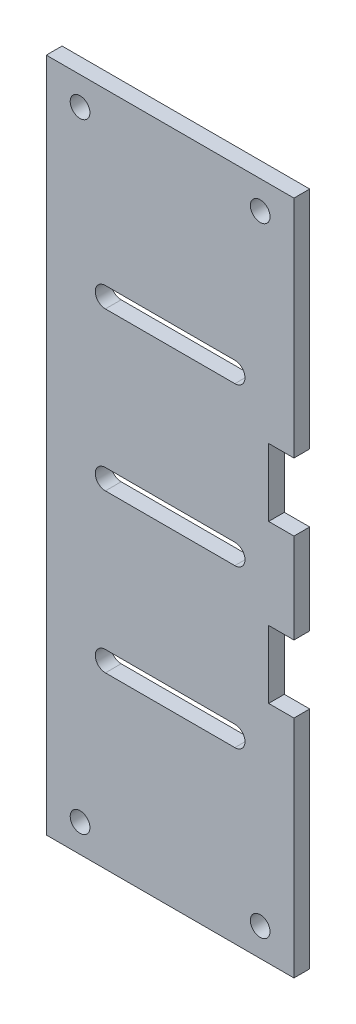
ISO-10303-21;
HEADER;
FILE_DESCRIPTION(('STEP AP214'),'2;1');
FILE_NAME('part.step','',(''),(''),'','','');
FILE_SCHEMA(('AUTOMOTIVE_DESIGN { 1 0 10303 214 1 1 1 1 }'));
ENDSEC;
DATA;
#1=APPLICATION_CONTEXT('core data for automotive mechanical design processes');
#2=APPLICATION_PROTOCOL_DEFINITION('international standard','automotive_design',2000,#1);
#3=PRODUCT_CONTEXT('',#1,'mechanical');
#4=PRODUCT('Part','Part','',(#3));
#5=PRODUCT_RELATED_PRODUCT_CATEGORY('part','',(#4));
#6=PRODUCT_DEFINITION_FORMATION('','',#4);
#7=PRODUCT_DEFINITION_CONTEXT('part definition',#1,'design');
#8=PRODUCT_DEFINITION('design','',#6,#7);
#9=PRODUCT_DEFINITION_SHAPE('','',#8);
#10=(LENGTH_UNIT() NAMED_UNIT(*) SI_UNIT(.MILLI.,.METRE.));
#11=(NAMED_UNIT(*) PLANE_ANGLE_UNIT() SI_UNIT($,.RADIAN.));
#12=(NAMED_UNIT(*) SI_UNIT($,.STERADIAN.) SOLID_ANGLE_UNIT());
#13=UNCERTAINTY_MEASURE_WITH_UNIT(LENGTH_MEASURE(1.E-05),#10,'distance_accuracy_value','');
#14=(GEOMETRIC_REPRESENTATION_CONTEXT(3) GLOBAL_UNCERTAINTY_ASSIGNED_CONTEXT((#13)) GLOBAL_UNIT_ASSIGNED_CONTEXT((#10,
#11,#12)) REPRESENTATION_CONTEXT('',''));
#15=CARTESIAN_POINT('',(0.,0.,0.));
#16=DIRECTION('',(0.,0.,1.));
#17=DIRECTION('',(1.,0.,0.));
#18=AXIS2_PLACEMENT_3D('',#15,#16,#17);
#19=CARTESIAN_POINT('',(0.,0.,2.8));
#20=DIRECTION('',(0.,0.,1.));
#21=DIRECTION('',(1.,0.,0.));
#22=AXIS2_PLACEMENT_3D('',#19,#20,#21);
#23=PLANE('',#22);
#24=CARTESIAN_POINT('',(16.,-55.,2.8));
#25=DIRECTION('',(0.,0.,1.));
#26=DIRECTION('',(1.,0.,0.));
#27=AXIS2_PLACEMENT_3D('',#24,#25,#26);
#28=CIRCLE('',#27,1.75);
#29=CARTESIAN_POINT('',(17.75,-55.,2.8));
#30=VERTEX_POINT('',#29);
#31=EDGE_CURVE('E304',#30,#30,#28,.T.);
#32=ORIENTED_EDGE('',*,*,#31,.F.);
#33=EDGE_LOOP('',(#32));
#34=FACE_BOUND('',#33,.T.);
#35=CARTESIAN_POINT('',(-16.,-55.,2.8));
#36=DIRECTION('',(0.,0.,1.));
#37=DIRECTION('',(1.,0.,0.));
#38=AXIS2_PLACEMENT_3D('',#35,#36,#37);
#39=CIRCLE('',#38,1.75);
#40=CARTESIAN_POINT('',(-14.25,-55.,2.8));
#41=VERTEX_POINT('',#40);
#42=EDGE_CURVE('E316',#41,#41,#39,.T.);
#43=ORIENTED_EDGE('',*,*,#42,.F.);
#44=EDGE_LOOP('',(#43));
#45=FACE_BOUND('',#44,.T.);
#46=DIRECTION('',(0.,-1.,0.));
#47=VECTOR('',#46,1.);
#48=CARTESIAN_POINT('',(-22.,60.,2.8));
#49=LINE('',#48,#47);
#50=CARTESIAN_POINT('',(-22.,60.,2.8));
#51=VERTEX_POINT('',#50);
#52=CARTESIAN_POINT('',(-22.,-60.,2.8));
#53=VERTEX_POINT('',#52);
#54=EDGE_CURVE('E322',#51,#53,#49,.T.);
#55=ORIENTED_EDGE('',*,*,#54,.T.);
#56=DIRECTION('',(1.,0.,0.));
#57=VECTOR('',#56,1.);
#58=CARTESIAN_POINT('',(-22.,-60.,2.8));
#59=LINE('',#58,#57);
#60=CARTESIAN_POINT('',(22.,-60.,2.8));
#61=VERTEX_POINT('',#60);
#62=EDGE_CURVE('E325',#53,#61,#59,.T.);
#63=ORIENTED_EDGE('',*,*,#62,.T.);
#64=DIRECTION('',(0.,1.,0.));
#65=VECTOR('',#64,1.);
#66=CARTESIAN_POINT('',(22.,-60.,2.8));
#67=LINE('',#66,#65);
#68=CARTESIAN_POINT('',(22.,-20.,2.8));
#69=VERTEX_POINT('',#68);
#70=EDGE_CURVE('E328',#61,#69,#67,.T.);
#71=ORIENTED_EDGE('',*,*,#70,.T.);
#72=DIRECTION('',(-1.,0.,0.));
#73=VECTOR('',#72,1.);
#74=CARTESIAN_POINT('',(22.,-20.,2.8));
#75=LINE('',#74,#73);
#76=CARTESIAN_POINT('',(17.5,-20.,2.8));
#77=VERTEX_POINT('',#76);
#78=EDGE_CURVE('E330',#69,#77,#75,.T.);
#79=ORIENTED_EDGE('',*,*,#78,.T.);
#80=DIRECTION('',(0.,1.,0.));
#81=VECTOR('',#80,1.);
#82=CARTESIAN_POINT('',(17.5,-20.,2.8));
#83=LINE('',#82,#81);
#84=CARTESIAN_POINT('',(17.5,-8.,2.8));
#85=VERTEX_POINT('',#84);
#86=EDGE_CURVE('E332',#77,#85,#83,.T.);
#87=ORIENTED_EDGE('',*,*,#86,.T.);
#88=DIRECTION('',(1.,0.,0.));
#89=VECTOR('',#88,1.);
#90=CARTESIAN_POINT('',(17.5,-8.,2.8));
#91=LINE('',#90,#89);
#92=CARTESIAN_POINT('',(22.,-8.,2.8));
#93=VERTEX_POINT('',#92);
#94=EDGE_CURVE('E334',#85,#93,#91,.T.);
#95=ORIENTED_EDGE('',*,*,#94,.T.);
#96=DIRECTION('',(0.,1.,0.));
#97=VECTOR('',#96,1.);
#98=CARTESIAN_POINT('',(22.,-8.,2.8));
#99=LINE('',#98,#97);
#100=CARTESIAN_POINT('',(22.,8.,2.8));
#101=VERTEX_POINT('',#100);
#102=EDGE_CURVE('E336',#93,#101,#99,.T.);
#103=ORIENTED_EDGE('',*,*,#102,.T.);
#104=DIRECTION('',(-1.,0.,0.));
#105=VECTOR('',#104,1.);
#106=CARTESIAN_POINT('',(22.,8.,2.8));
#107=LINE('',#106,#105);
#108=CARTESIAN_POINT('',(17.5,8.,2.8));
#109=VERTEX_POINT('',#108);
#110=EDGE_CURVE('E338',#101,#109,#107,.T.);
#111=ORIENTED_EDGE('',*,*,#110,.T.);
#112=DIRECTION('',(0.,1.,0.));
#113=VECTOR('',#112,1.);
#114=CARTESIAN_POINT('',(17.5,8.,2.8));
#115=LINE('',#114,#113);
#116=CARTESIAN_POINT('',(17.5,20.,2.8));
#117=VERTEX_POINT('',#116);
#118=EDGE_CURVE('E340',#109,#117,#115,.T.);
#119=ORIENTED_EDGE('',*,*,#118,.T.);
#120=DIRECTION('',(1.,0.,0.));
#121=VECTOR('',#120,1.);
#122=CARTESIAN_POINT('',(17.5,20.,2.8));
#123=LINE('',#122,#121);
#124=CARTESIAN_POINT('',(22.,20.,2.8));
#125=VERTEX_POINT('',#124);
#126=EDGE_CURVE('E342',#117,#125,#123,.T.);
#127=ORIENTED_EDGE('',*,*,#126,.T.);
#128=DIRECTION('',(0.,1.,0.));
#129=VECTOR('',#128,1.);
#130=CARTESIAN_POINT('',(22.,20.,2.8));
#131=LINE('',#130,#129);
#132=CARTESIAN_POINT('',(22.,60.,2.8));
#133=VERTEX_POINT('',#132);
#134=EDGE_CURVE('E344',#125,#133,#131,.T.);
#135=ORIENTED_EDGE('',*,*,#134,.T.);
#136=DIRECTION('',(-1.,0.,0.));
#137=VECTOR('',#136,1.);
#138=CARTESIAN_POINT('',(22.,60.,2.8));
#139=LINE('',#138,#137);
#140=EDGE_CURVE('E346',#133,#51,#139,.T.);
#141=ORIENTED_EDGE('',*,*,#140,.T.);
#142=EDGE_LOOP('',(#55,#63,#71,#79,#87,#95,#103,#111,#119,#127,#135,#141));
#143=FACE_BOUND('',#142,.T.);
#144=CARTESIAN_POINT('',(-16.,55.,2.8));
#145=DIRECTION('',(0.,0.,1.));
#146=DIRECTION('',(1.,0.,0.));
#147=AXIS2_PLACEMENT_3D('',#144,#145,#146);
#148=CIRCLE('',#147,1.75);
#149=CARTESIAN_POINT('',(-14.25,55.,2.8));
#150=VERTEX_POINT('',#149);
#151=EDGE_CURVE('E310',#150,#150,#148,.T.);
#152=ORIENTED_EDGE('',*,*,#151,.F.);
#153=EDGE_LOOP('',(#152));
#154=FACE_BOUND('',#153,.T.);
#155=CARTESIAN_POINT('',(16.,55.,2.8));
#156=DIRECTION('',(0.,0.,1.));
#157=DIRECTION('',(1.,0.,0.));
#158=AXIS2_PLACEMENT_3D('',#155,#156,#157);
#159=CIRCLE('',#158,1.75);
#160=CARTESIAN_POINT('',(17.75,55.,2.8));
#161=VERTEX_POINT('',#160);
#162=EDGE_CURVE('E298',#161,#161,#159,.T.);
#163=ORIENTED_EDGE('',*,*,#162,.F.);
#164=EDGE_LOOP('',(#163));
#165=FACE_BOUND('',#164,.T.);
#166=DIRECTION('',(1.,0.,0.));
#167=VECTOR('',#166,1.);
#168=CARTESIAN_POINT('',(-11.5,-29.8,2.8));
#169=LINE('',#168,#167);
#170=CARTESIAN_POINT('',(-11.5,-29.8,2.8));
#171=VERTEX_POINT('',#170);
#172=CARTESIAN_POINT('',(11.5,-29.8,2.8));
#173=VERTEX_POINT('',#172);
#174=EDGE_CURVE('E269',#171,#173,#169,.T.);
#175=ORIENTED_EDGE('',*,*,#174,.F.);
#176=CARTESIAN_POINT('',(-11.5,-28.,2.8));
#177=DIRECTION('',(0.,0.,1.));
#178=DIRECTION('',(1.,0.,0.));
#179=AXIS2_PLACEMENT_3D('',#176,#177,#178);
#180=CIRCLE('',#179,1.8);
#181=CARTESIAN_POINT('',(-11.5,-26.2,2.8));
#182=VERTEX_POINT('',#181);
#183=EDGE_CURVE('E267',#182,#171,#180,.T.);
#184=ORIENTED_EDGE('',*,*,#183,.F.);
#185=DIRECTION('',(-1.,0.,0.));
#186=VECTOR('',#185,1.);
#187=CARTESIAN_POINT('',(11.5,-26.2,2.8));
#188=LINE('',#187,#186);
#189=CARTESIAN_POINT('',(11.5,-26.2,2.8));
#190=VERTEX_POINT('',#189);
#191=EDGE_CURVE('E275',#190,#182,#188,.T.);
#192=ORIENTED_EDGE('',*,*,#191,.F.);
#193=CARTESIAN_POINT('',(11.5,-28.,2.8));
#194=DIRECTION('',(0.,0.,1.));
#195=DIRECTION('',(1.,0.,0.));
#196=AXIS2_PLACEMENT_3D('',#193,#194,#195);
#197=CIRCLE('',#196,1.8);
#198=EDGE_CURVE('E272',#173,#190,#197,.T.);
#199=ORIENTED_EDGE('',*,*,#198,.F.);
#200=EDGE_LOOP('',(#175,#184,#192,#199));
#201=FACE_BOUND('',#200,.T.);
#202=DIRECTION('',(1.,0.,0.));
#203=VECTOR('',#202,1.);
#204=CARTESIAN_POINT('',(-11.5,-1.8,2.8));
#205=LINE('',#204,#203);
#206=CARTESIAN_POINT('',(-11.5,-1.8,2.8));
#207=VERTEX_POINT('',#206);
#208=CARTESIAN_POINT('',(11.5,-1.8,2.8));
#209=VERTEX_POINT('',#208);
#210=EDGE_CURVE('E238',#207,#209,#205,.T.);
#211=ORIENTED_EDGE('',*,*,#210,.F.);
#212=CARTESIAN_POINT('',(-11.5,0.,2.8));
#213=DIRECTION('',(0.,0.,1.));
#214=DIRECTION('',(1.,0.,0.));
#215=AXIS2_PLACEMENT_3D('',#212,#213,#214);
#216=CIRCLE('',#215,1.8);
#217=CARTESIAN_POINT('',(-11.5,1.8,2.8));
#218=VERTEX_POINT('',#217);
#219=EDGE_CURVE('E236',#218,#207,#216,.T.);
#220=ORIENTED_EDGE('',*,*,#219,.F.);
#221=DIRECTION('',(-1.,0.,0.));
#222=VECTOR('',#221,1.);
#223=CARTESIAN_POINT('',(11.5,1.8,2.8));
#224=LINE('',#223,#222);
#225=CARTESIAN_POINT('',(11.5,1.8,2.8));
#226=VERTEX_POINT('',#225);
#227=EDGE_CURVE('E244',#226,#218,#224,.T.);
#228=ORIENTED_EDGE('',*,*,#227,.F.);
#229=CARTESIAN_POINT('',(11.5,0.,2.8));
#230=DIRECTION('',(0.,0.,1.));
#231=DIRECTION('',(1.,0.,0.));
#232=AXIS2_PLACEMENT_3D('',#229,#230,#231);
#233=CIRCLE('',#232,1.8);
#234=EDGE_CURVE('E241',#209,#226,#233,.T.);
#235=ORIENTED_EDGE('',*,*,#234,.F.);
#236=EDGE_LOOP('',(#211,#220,#228,#235));
#237=FACE_BOUND('',#236,.T.);
#238=DIRECTION('',(1.,0.,0.));
#239=VECTOR('',#238,1.);
#240=CARTESIAN_POINT('',(-11.5,26.2,2.8));
#241=LINE('',#240,#239);
#242=CARTESIAN_POINT('',(-11.5,26.2,2.8));
#243=VERTEX_POINT('',#242);
#244=CARTESIAN_POINT('',(11.5,26.2,2.8));
#245=VERTEX_POINT('',#244);
#246=EDGE_CURVE('E208',#243,#245,#241,.T.);
#247=ORIENTED_EDGE('',*,*,#246,.F.);
#248=CARTESIAN_POINT('',(-11.5,28.,2.8));
#249=DIRECTION('',(0.,0.,1.));
#250=DIRECTION('',(1.,0.,0.));
#251=AXIS2_PLACEMENT_3D('',#248,#249,#250);
#252=CIRCLE('',#251,1.8);
#253=CARTESIAN_POINT('',(-11.5,29.8,2.8));
#254=VERTEX_POINT('',#253);
#255=EDGE_CURVE('E200',#254,#243,#252,.T.);
#256=ORIENTED_EDGE('',*,*,#255,.F.);
#257=DIRECTION('',(-1.,0.,0.));
#258=VECTOR('',#257,1.);
#259=CARTESIAN_POINT('',(11.5,29.8,2.8));
#260=LINE('',#259,#258);
#261=CARTESIAN_POINT('',(11.5,29.8,2.8));
#262=VERTEX_POINT('',#261);
#263=EDGE_CURVE('E222',#262,#254,#260,.T.);
#264=ORIENTED_EDGE('',*,*,#263,.F.);
#265=CARTESIAN_POINT('',(11.5,28.,2.8));
#266=DIRECTION('',(0.,0.,1.));
#267=DIRECTION('',(1.,0.,0.));
#268=AXIS2_PLACEMENT_3D('',#265,#266,#267);
#269=CIRCLE('',#268,1.8);
#270=EDGE_CURVE('E220',#245,#262,#269,.T.);
#271=ORIENTED_EDGE('',*,*,#270,.F.);
#272=EDGE_LOOP('',(#247,#256,#264,#271));
#273=FACE_BOUND('',#272,.T.);
#274=ADVANCED_FACE('F39',(#34,#45,#143,#154,#165,#201,#237,#273),#23,.T.);
#275=CARTESIAN_POINT('',(0.,0.,0.));
#276=DIRECTION('',(0.,0.,1.));
#277=DIRECTION('',(1.,0.,0.));
#278=AXIS2_PLACEMENT_3D('',#275,#276,#277);
#279=PLANE('',#278);
#280=CARTESIAN_POINT('',(-11.5,0.,0.));
#281=DIRECTION('',(0.,0.,1.));
#282=DIRECTION('',(1.,0.,0.));
#283=AXIS2_PLACEMENT_3D('',#280,#281,#282);
#284=CIRCLE('',#283,1.8);
#285=CARTESIAN_POINT('',(-11.5,1.8,0.));
#286=VERTEX_POINT('',#285);
#287=CARTESIAN_POINT('',(-11.5,-1.8,0.));
#288=VERTEX_POINT('',#287);
#289=EDGE_CURVE('E216',#286,#288,#284,.T.);
#290=ORIENTED_EDGE('',*,*,#289,.T.);
#291=DIRECTION('',(1.,0.,0.));
#292=VECTOR('',#291,1.);
#293=CARTESIAN_POINT('',(-11.5,-1.8,0.));
#294=LINE('',#293,#292);
#295=CARTESIAN_POINT('',(11.5,-1.8,0.));
#296=VERTEX_POINT('',#295);
#297=EDGE_CURVE('E249',#288,#296,#294,.T.);
#298=ORIENTED_EDGE('',*,*,#297,.T.);
#299=CARTESIAN_POINT('',(11.5,0.,0.));
#300=DIRECTION('',(0.,0.,1.));
#301=DIRECTION('',(1.,0.,0.));
#302=AXIS2_PLACEMENT_3D('',#299,#300,#301);
#303=CIRCLE('',#302,1.8);
#304=CARTESIAN_POINT('',(11.5,1.8,0.));
#305=VERTEX_POINT('',#304);
#306=EDGE_CURVE('E252',#296,#305,#303,.T.);
#307=ORIENTED_EDGE('',*,*,#306,.T.);
#308=DIRECTION('',(-1.,0.,0.));
#309=VECTOR('',#308,1.);
#310=CARTESIAN_POINT('',(11.5,1.8,0.));
#311=LINE('',#310,#309);
#312=EDGE_CURVE('E239',#305,#286,#311,.T.);
#313=ORIENTED_EDGE('',*,*,#312,.T.);
#314=EDGE_LOOP('',(#290,#298,#307,#313));
#315=FACE_BOUND('',#314,.T.);
#316=CARTESIAN_POINT('',(16.,55.,0.));
#317=DIRECTION('',(0.,0.,1.));
#318=DIRECTION('',(1.,0.,0.));
#319=AXIS2_PLACEMENT_3D('',#316,#317,#318);
#320=CIRCLE('',#319,1.75);
#321=CARTESIAN_POINT('',(17.75,55.,0.));
#322=VERTEX_POINT('',#321);
#323=EDGE_CURVE('E297',#322,#322,#320,.T.);
#324=ORIENTED_EDGE('',*,*,#323,.T.);
#325=EDGE_LOOP('',(#324));
#326=FACE_BOUND('',#325,.T.);
#327=CARTESIAN_POINT('',(16.,-55.,0.));
#328=DIRECTION('',(0.,0.,1.));
#329=DIRECTION('',(1.,0.,0.));
#330=AXIS2_PLACEMENT_3D('',#327,#328,#329);
#331=CIRCLE('',#330,1.75);
#332=CARTESIAN_POINT('',(17.75,-55.,0.));
#333=VERTEX_POINT('',#332);
#334=EDGE_CURVE('E301',#333,#333,#331,.T.);
#335=ORIENTED_EDGE('',*,*,#334,.T.);
#336=EDGE_LOOP('',(#335));
#337=FACE_BOUND('',#336,.T.);
#338=CARTESIAN_POINT('',(-16.,55.,0.));
#339=DIRECTION('',(0.,0.,1.));
#340=DIRECTION('',(1.,0.,0.));
#341=AXIS2_PLACEMENT_3D('',#338,#339,#340);
#342=CIRCLE('',#341,1.75);
#343=CARTESIAN_POINT('',(-14.25,55.,0.));
#344=VERTEX_POINT('',#343);
#345=EDGE_CURVE('E307',#344,#344,#342,.T.);
#346=ORIENTED_EDGE('',*,*,#345,.T.);
#347=EDGE_LOOP('',(#346));
#348=FACE_BOUND('',#347,.T.);
#349=CARTESIAN_POINT('',(-16.,-55.,0.));
#350=DIRECTION('',(0.,0.,1.));
#351=DIRECTION('',(1.,0.,0.));
#352=AXIS2_PLACEMENT_3D('',#349,#350,#351);
#353=CIRCLE('',#352,1.75);
#354=CARTESIAN_POINT('',(-14.25,-55.,0.));
#355=VERTEX_POINT('',#354);
#356=EDGE_CURVE('E313',#355,#355,#353,.T.);
#357=ORIENTED_EDGE('',*,*,#356,.T.);
#358=EDGE_LOOP('',(#357));
#359=FACE_BOUND('',#358,.T.);
#360=DIRECTION('',(0.,-1.,0.));
#361=VECTOR('',#360,1.);
#362=CARTESIAN_POINT('',(-22.,60.,0.));
#363=LINE('',#362,#361);
#364=CARTESIAN_POINT('',(-22.,60.,0.));
#365=VERTEX_POINT('',#364);
#366=CARTESIAN_POINT('',(-22.,-60.,0.));
#367=VERTEX_POINT('',#366);
#368=EDGE_CURVE('E319',#365,#367,#363,.T.);
#369=ORIENTED_EDGE('',*,*,#368,.F.);
#370=DIRECTION('',(-1.,0.,0.));
#371=VECTOR('',#370,1.);
#372=CARTESIAN_POINT('',(22.,60.,0.));
#373=LINE('',#372,#371);
#374=CARTESIAN_POINT('',(22.,60.,0.));
#375=VERTEX_POINT('',#374);
#376=EDGE_CURVE('E326',#375,#365,#373,.T.);
#377=ORIENTED_EDGE('',*,*,#376,.F.);
#378=DIRECTION('',(0.,1.,0.));
#379=VECTOR('',#378,1.);
#380=CARTESIAN_POINT('',(22.,20.,0.));
#381=LINE('',#380,#379);
#382=CARTESIAN_POINT('',(22.,20.,0.));
#383=VERTEX_POINT('',#382);
#384=EDGE_CURVE('E369',#383,#375,#381,.T.);
#385=ORIENTED_EDGE('',*,*,#384,.F.);
#386=DIRECTION('',(1.,0.,0.));
#387=VECTOR('',#386,1.);
#388=CARTESIAN_POINT('',(17.5,20.,0.));
#389=LINE('',#388,#387);
#390=CARTESIAN_POINT('',(17.5,20.,0.));
#391=VERTEX_POINT('',#390);
#392=EDGE_CURVE('E367',#391,#383,#389,.T.);
#393=ORIENTED_EDGE('',*,*,#392,.F.);
#394=DIRECTION('',(0.,1.,0.));
#395=VECTOR('',#394,1.);
#396=CARTESIAN_POINT('',(17.5,8.,0.));
#397=LINE('',#396,#395);
#398=CARTESIAN_POINT('',(17.5,8.,0.));
#399=VERTEX_POINT('',#398);
#400=EDGE_CURVE('E365',#399,#391,#397,.T.);
#401=ORIENTED_EDGE('',*,*,#400,.F.);
#402=DIRECTION('',(-1.,0.,0.));
#403=VECTOR('',#402,1.);
#404=CARTESIAN_POINT('',(22.,8.,0.));
#405=LINE('',#404,#403);
#406=CARTESIAN_POINT('',(22.,8.,0.));
#407=VERTEX_POINT('',#406);
#408=EDGE_CURVE('E363',#407,#399,#405,.T.);
#409=ORIENTED_EDGE('',*,*,#408,.F.);
#410=DIRECTION('',(0.,1.,0.));
#411=VECTOR('',#410,1.);
#412=CARTESIAN_POINT('',(22.,-8.,0.));
#413=LINE('',#412,#411);
#414=CARTESIAN_POINT('',(22.,-8.,0.));
#415=VERTEX_POINT('',#414);
#416=EDGE_CURVE('E361',#415,#407,#413,.T.);
#417=ORIENTED_EDGE('',*,*,#416,.F.);
#418=DIRECTION('',(1.,0.,0.));
#419=VECTOR('',#418,1.);
#420=CARTESIAN_POINT('',(17.5,-8.,0.));
#421=LINE('',#420,#419);
#422=CARTESIAN_POINT('',(17.5,-8.,0.));
#423=VERTEX_POINT('',#422);
#424=EDGE_CURVE('E359',#423,#415,#421,.T.);
#425=ORIENTED_EDGE('',*,*,#424,.F.);
#426=DIRECTION('',(0.,1.,0.));
#427=VECTOR('',#426,1.);
#428=CARTESIAN_POINT('',(17.5,-20.,0.));
#429=LINE('',#428,#427);
#430=CARTESIAN_POINT('',(17.5,-20.,0.));
#431=VERTEX_POINT('',#430);
#432=EDGE_CURVE('E357',#431,#423,#429,.T.);
#433=ORIENTED_EDGE('',*,*,#432,.F.);
#434=DIRECTION('',(-1.,0.,0.));
#435=VECTOR('',#434,1.);
#436=CARTESIAN_POINT('',(22.,-20.,0.));
#437=LINE('',#436,#435);
#438=CARTESIAN_POINT('',(22.,-20.,0.));
#439=VERTEX_POINT('',#438);
#440=EDGE_CURVE('E355',#439,#431,#437,.T.);
#441=ORIENTED_EDGE('',*,*,#440,.F.);
#442=DIRECTION('',(0.,1.,0.));
#443=VECTOR('',#442,1.);
#444=CARTESIAN_POINT('',(22.,-60.,0.));
#445=LINE('',#444,#443);
#446=CARTESIAN_POINT('',(22.,-60.,0.));
#447=VERTEX_POINT('',#446);
#448=EDGE_CURVE('E353',#447,#439,#445,.T.);
#449=ORIENTED_EDGE('',*,*,#448,.F.);
#450=DIRECTION('',(1.,0.,0.));
#451=VECTOR('',#450,1.);
#452=CARTESIAN_POINT('',(-22.,-60.,0.));
#453=LINE('',#452,#451);
#454=EDGE_CURVE('E351',#367,#447,#453,.T.);
#455=ORIENTED_EDGE('',*,*,#454,.F.);
#456=EDGE_LOOP('',(#369,#377,#385,#393,#401,#409,#417,#425,#433,#441,#449,#455));
#457=FACE_BOUND('',#456,.T.);
#458=CARTESIAN_POINT('',(-11.5,-28.,0.));
#459=DIRECTION('',(0.,0.,1.));
#460=DIRECTION('',(1.,0.,0.));
#461=AXIS2_PLACEMENT_3D('',#458,#459,#460);
#462=CIRCLE('',#461,1.8);
#463=CARTESIAN_POINT('',(-11.5,-26.2,0.));
#464=VERTEX_POINT('',#463);
#465=CARTESIAN_POINT('',(-11.5,-29.8,0.));
#466=VERTEX_POINT('',#465);
#467=EDGE_CURVE('E266',#464,#466,#462,.T.);
#468=ORIENTED_EDGE('',*,*,#467,.T.);
#469=DIRECTION('',(1.,0.,0.));
#470=VECTOR('',#469,1.);
#471=CARTESIAN_POINT('',(-11.5,-29.8,0.));
#472=LINE('',#471,#470);
#473=CARTESIAN_POINT('',(11.5,-29.8,0.));
#474=VERTEX_POINT('',#473);
#475=EDGE_CURVE('E280',#466,#474,#472,.T.);
#476=ORIENTED_EDGE('',*,*,#475,.T.);
#477=CARTESIAN_POINT('',(11.5,-28.,0.));
#478=DIRECTION('',(0.,0.,1.));
#479=DIRECTION('',(1.,0.,0.));
#480=AXIS2_PLACEMENT_3D('',#477,#478,#479);
#481=CIRCLE('',#480,1.8);
#482=CARTESIAN_POINT('',(11.5,-26.2,0.));
#483=VERTEX_POINT('',#482);
#484=EDGE_CURVE('E283',#474,#483,#481,.T.);
#485=ORIENTED_EDGE('',*,*,#484,.T.);
#486=DIRECTION('',(-1.,0.,0.));
#487=VECTOR('',#486,1.);
#488=CARTESIAN_POINT('',(11.5,-26.2,0.));
#489=LINE('',#488,#487);
#490=EDGE_CURVE('E270',#483,#464,#489,.T.);
#491=ORIENTED_EDGE('',*,*,#490,.T.);
#492=EDGE_LOOP('',(#468,#476,#485,#491));
#493=FACE_BOUND('',#492,.T.);
#494=CARTESIAN_POINT('',(-11.5,28.,0.));
#495=DIRECTION('',(0.,0.,1.));
#496=DIRECTION('',(1.,0.,0.));
#497=AXIS2_PLACEMENT_3D('',#494,#495,#496);
#498=CIRCLE('',#497,1.8);
#499=CARTESIAN_POINT('',(-11.5,29.8,0.));
#500=VERTEX_POINT('',#499);
#501=CARTESIAN_POINT('',(-11.5,26.2,0.));
#502=VERTEX_POINT('',#501);
#503=EDGE_CURVE('E62',#500,#502,#498,.T.);
#504=ORIENTED_EDGE('',*,*,#503,.T.);
#505=DIRECTION('',(1.,0.,0.));
#506=VECTOR('',#505,1.);
#507=CARTESIAN_POINT('',(-11.5,26.2,0.));
#508=LINE('',#507,#506);
#509=CARTESIAN_POINT('',(11.5,26.2,0.));
#510=VERTEX_POINT('',#509);
#511=EDGE_CURVE('E215',#502,#510,#508,.T.);
#512=ORIENTED_EDGE('',*,*,#511,.T.);
#513=CARTESIAN_POINT('',(11.5,28.,0.));
#514=DIRECTION('',(0.,0.,1.));
#515=DIRECTION('',(1.,0.,0.));
#516=AXIS2_PLACEMENT_3D('',#513,#514,#515);
#517=CIRCLE('',#516,1.8);
#518=CARTESIAN_POINT('',(11.5,29.8,0.));
#519=VERTEX_POINT('',#518);
#520=EDGE_CURVE('E228',#510,#519,#517,.T.);
#521=ORIENTED_EDGE('',*,*,#520,.T.);
#522=DIRECTION('',(-1.,0.,0.));
#523=VECTOR('',#522,1.);
#524=CARTESIAN_POINT('',(11.5,29.8,0.));
#525=LINE('',#524,#523);
#526=EDGE_CURVE('E209',#519,#500,#525,.T.);
#527=ORIENTED_EDGE('',*,*,#526,.T.);
#528=EDGE_LOOP('',(#504,#512,#521,#527));
#529=FACE_BOUND('',#528,.T.);
#530=ADVANCED_FACE('F411',(#315,#326,#337,#348,#359,#457,#493,#529),#279,.F.);
#531=CARTESIAN_POINT('',(-22.,60.,2.8));
#532=DIRECTION('',(1.,0.,0.));
#533=DIRECTION('',(0.,0.,-1.));
#534=AXIS2_PLACEMENT_3D('',#531,#532,#533);
#535=PLANE('',#534);
#536=ORIENTED_EDGE('',*,*,#368,.T.);
#537=DIRECTION('',(0.,0.,-1.));
#538=VECTOR('',#537,1.);
#539=CARTESIAN_POINT('',(-22.,-60.,2.8));
#540=LINE('',#539,#538);
#541=EDGE_CURVE('E11',#53,#367,#540,.T.);
#542=ORIENTED_EDGE('',*,*,#541,.F.);
#543=ORIENTED_EDGE('',*,*,#54,.F.);
#544=DIRECTION('',(0.,0.,-1.));
#545=VECTOR('',#544,1.);
#546=CARTESIAN_POINT('',(-22.,60.,2.8));
#547=LINE('',#546,#545);
#548=EDGE_CURVE('E348',#51,#365,#547,.T.);
#549=ORIENTED_EDGE('',*,*,#548,.T.);
#550=EDGE_LOOP('',(#536,#542,#543,#549));
#551=FACE_BOUND('',#550,.T.);
#552=ADVANCED_FACE('F41',(#551),#535,.F.);
#553=CARTESIAN_POINT('',(-22.,-60.,2.8));
#554=DIRECTION('',(0.,1.,0.));
#555=DIRECTION('',(0.,0.,1.));
#556=AXIS2_PLACEMENT_3D('',#553,#554,#555);
#557=PLANE('',#556);
#558=ORIENTED_EDGE('',*,*,#454,.T.);
#559=DIRECTION('',(0.,0.,-1.));
#560=VECTOR('',#559,1.);
#561=CARTESIAN_POINT('',(22.,-60.,2.8));
#562=LINE('',#561,#560);
#563=EDGE_CURVE('E47',#61,#447,#562,.T.);
#564=ORIENTED_EDGE('',*,*,#563,.F.);
#565=ORIENTED_EDGE('',*,*,#62,.F.);
#566=ORIENTED_EDGE('',*,*,#541,.T.);
#567=EDGE_LOOP('',(#558,#564,#565,#566));
#568=FACE_BOUND('',#567,.T.);
#569=ADVANCED_FACE('F429',(#568),#557,.F.);
#570=CARTESIAN_POINT('',(22.,-60.,2.8));
#571=DIRECTION('',(-1.,0.,0.));
#572=DIRECTION('',(0.,0.,1.));
#573=AXIS2_PLACEMENT_3D('',#570,#571,#572);
#574=PLANE('',#573);
#575=ORIENTED_EDGE('',*,*,#448,.T.);
#576=DIRECTION('',(0.,0.,-1.));
#577=VECTOR('',#576,1.);
#578=CARTESIAN_POINT('',(22.,-20.,2.8));
#579=LINE('',#578,#577);
#580=EDGE_CURVE('E398',#69,#439,#579,.T.);
#581=ORIENTED_EDGE('',*,*,#580,.F.);
#582=ORIENTED_EDGE('',*,*,#70,.F.);
#583=ORIENTED_EDGE('',*,*,#563,.T.);
#584=EDGE_LOOP('',(#575,#581,#582,#583));
#585=FACE_BOUND('',#584,.T.);
#586=ADVANCED_FACE('F405',(#585),#574,.F.);
#587=CARTESIAN_POINT('',(22.,-20.,2.8));
#588=DIRECTION('',(0.,-1.,0.));
#589=DIRECTION('',(0.,0.,-1.));
#590=AXIS2_PLACEMENT_3D('',#587,#588,#589);
#591=PLANE('',#590);
#592=ORIENTED_EDGE('',*,*,#440,.T.);
#593=DIRECTION('',(0.,0.,-1.));
#594=VECTOR('',#593,1.);
#595=CARTESIAN_POINT('',(17.5,-20.,2.8));
#596=LINE('',#595,#594);
#597=EDGE_CURVE('E395',#77,#431,#596,.T.);
#598=ORIENTED_EDGE('',*,*,#597,.F.);
#599=ORIENTED_EDGE('',*,*,#78,.F.);
#600=ORIENTED_EDGE('',*,*,#580,.T.);
#601=EDGE_LOOP('',(#592,#598,#599,#600));
#602=FACE_BOUND('',#601,.T.);
#603=ADVANCED_FACE('F417',(#602),#591,.F.);
#604=CARTESIAN_POINT('',(17.5,-20.,2.8));
#605=DIRECTION('',(-1.,0.,0.));
#606=DIRECTION('',(0.,0.,1.));
#607=AXIS2_PLACEMENT_3D('',#604,#605,#606);
#608=PLANE('',#607);
#609=ORIENTED_EDGE('',*,*,#432,.T.);
#610=DIRECTION('',(0.,0.,-1.));
#611=VECTOR('',#610,1.);
#612=CARTESIAN_POINT('',(17.5,-8.,2.8));
#613=LINE('',#612,#611);
#614=EDGE_CURVE('E392',#85,#423,#613,.T.);
#615=ORIENTED_EDGE('',*,*,#614,.F.);
#616=ORIENTED_EDGE('',*,*,#86,.F.);
#617=ORIENTED_EDGE('',*,*,#597,.T.);
#618=EDGE_LOOP('',(#609,#615,#616,#617));
#619=FACE_BOUND('',#618,.T.);
#620=ADVANCED_FACE('F421',(#619),#608,.F.);
#621=CARTESIAN_POINT('',(17.5,-8.,2.8));
#622=DIRECTION('',(0.,1.,0.));
#623=DIRECTION('',(0.,0.,1.));
#624=AXIS2_PLACEMENT_3D('',#621,#622,#623);
#625=PLANE('',#624);
#626=ORIENTED_EDGE('',*,*,#424,.T.);
#627=DIRECTION('',(0.,0.,-1.));
#628=VECTOR('',#627,1.);
#629=CARTESIAN_POINT('',(22.,-8.,2.8));
#630=LINE('',#629,#628);
#631=EDGE_CURVE('E389',#93,#415,#630,.T.);
#632=ORIENTED_EDGE('',*,*,#631,.F.);
#633=ORIENTED_EDGE('',*,*,#94,.F.);
#634=ORIENTED_EDGE('',*,*,#614,.T.);
#635=EDGE_LOOP('',(#626,#632,#633,#634));
#636=FACE_BOUND('',#635,.T.);
#637=ADVANCED_FACE('F462',(#636),#625,.F.);
#638=CARTESIAN_POINT('',(22.,-8.,2.8));
#639=DIRECTION('',(-1.,0.,0.));
#640=DIRECTION('',(0.,0.,1.));
#641=AXIS2_PLACEMENT_3D('',#638,#639,#640);
#642=PLANE('',#641);
#643=ORIENTED_EDGE('',*,*,#416,.T.);
#644=DIRECTION('',(0.,0.,-1.));
#645=VECTOR('',#644,1.);
#646=CARTESIAN_POINT('',(22.,8.,2.8));
#647=LINE('',#646,#645);
#648=EDGE_CURVE('E386',#101,#407,#647,.T.);
#649=ORIENTED_EDGE('',*,*,#648,.F.);
#650=ORIENTED_EDGE('',*,*,#102,.F.);
#651=ORIENTED_EDGE('',*,*,#631,.T.);
#652=EDGE_LOOP('',(#643,#649,#650,#651));
#653=FACE_BOUND('',#652,.T.);
#654=ADVANCED_FACE('F460',(#653),#642,.F.);
#655=CARTESIAN_POINT('',(22.,8.,2.8));
#656=DIRECTION('',(0.,-1.,0.));
#657=DIRECTION('',(0.,0.,-1.));
#658=AXIS2_PLACEMENT_3D('',#655,#656,#657);
#659=PLANE('',#658);
#660=ORIENTED_EDGE('',*,*,#408,.T.);
#661=DIRECTION('',(0.,0.,-1.));
#662=VECTOR('',#661,1.);
#663=CARTESIAN_POINT('',(17.5,8.,2.8));
#664=LINE('',#663,#662);
#665=EDGE_CURVE('E383',#109,#399,#664,.T.);
#666=ORIENTED_EDGE('',*,*,#665,.F.);
#667=ORIENTED_EDGE('',*,*,#110,.F.);
#668=ORIENTED_EDGE('',*,*,#648,.T.);
#669=EDGE_LOOP('',(#660,#666,#667,#668));
#670=FACE_BOUND('',#669,.T.);
#671=ADVANCED_FACE('F456',(#670),#659,.F.);
#672=CARTESIAN_POINT('',(17.5,8.,2.8));
#673=DIRECTION('',(-1.,0.,0.));
#674=DIRECTION('',(0.,0.,1.));
#675=AXIS2_PLACEMENT_3D('',#672,#673,#674);
#676=PLANE('',#675);
#677=ORIENTED_EDGE('',*,*,#400,.T.);
#678=DIRECTION('',(0.,0.,-1.));
#679=VECTOR('',#678,1.);
#680=CARTESIAN_POINT('',(17.5,20.,2.8));
#681=LINE('',#680,#679);
#682=EDGE_CURVE('E380',#117,#391,#681,.T.);
#683=ORIENTED_EDGE('',*,*,#682,.F.);
#684=ORIENTED_EDGE('',*,*,#118,.F.);
#685=ORIENTED_EDGE('',*,*,#665,.T.);
#686=EDGE_LOOP('',(#677,#683,#684,#685));
#687=FACE_BOUND('',#686,.T.);
#688=ADVANCED_FACE('F451',(#687),#676,.F.);
#689=CARTESIAN_POINT('',(17.5,20.,2.8));
#690=DIRECTION('',(0.,1.,0.));
#691=DIRECTION('',(0.,0.,1.));
#692=AXIS2_PLACEMENT_3D('',#689,#690,#691);
#693=PLANE('',#692);
#694=ORIENTED_EDGE('',*,*,#392,.T.);
#695=DIRECTION('',(0.,0.,-1.));
#696=VECTOR('',#695,1.);
#697=CARTESIAN_POINT('',(22.,20.,2.8));
#698=LINE('',#697,#696);
#699=EDGE_CURVE('E377',#125,#383,#698,.T.);
#700=ORIENTED_EDGE('',*,*,#699,.F.);
#701=ORIENTED_EDGE('',*,*,#126,.F.);
#702=ORIENTED_EDGE('',*,*,#682,.T.);
#703=EDGE_LOOP('',(#694,#700,#701,#702));
#704=FACE_BOUND('',#703,.T.);
#705=ADVANCED_FACE('F445',(#704),#693,.F.);
#706=CARTESIAN_POINT('',(22.,20.,2.8));
#707=DIRECTION('',(-1.,0.,0.));
#708=DIRECTION('',(0.,0.,1.));
#709=AXIS2_PLACEMENT_3D('',#706,#707,#708);
#710=PLANE('',#709);
#711=ORIENTED_EDGE('',*,*,#384,.T.);
#712=DIRECTION('',(0.,0.,-1.));
#713=VECTOR('',#712,1.);
#714=CARTESIAN_POINT('',(22.,60.,2.8));
#715=LINE('',#714,#713);
#716=EDGE_CURVE('E374',#133,#375,#715,.T.);
#717=ORIENTED_EDGE('',*,*,#716,.F.);
#718=ORIENTED_EDGE('',*,*,#134,.F.);
#719=ORIENTED_EDGE('',*,*,#699,.T.);
#720=EDGE_LOOP('',(#711,#717,#718,#719));
#721=FACE_BOUND('',#720,.T.);
#722=ADVANCED_FACE('F441',(#721),#710,.F.);
#723=CARTESIAN_POINT('',(22.,60.,2.8));
#724=DIRECTION('',(0.,-1.,0.));
#725=DIRECTION('',(0.,0.,-1.));
#726=AXIS2_PLACEMENT_3D('',#723,#724,#725);
#727=PLANE('',#726);
#728=ORIENTED_EDGE('',*,*,#376,.T.);
#729=ORIENTED_EDGE('',*,*,#548,.F.);
#730=ORIENTED_EDGE('',*,*,#140,.F.);
#731=ORIENTED_EDGE('',*,*,#716,.T.);
#732=EDGE_LOOP('',(#728,#729,#730,#731));
#733=FACE_BOUND('',#732,.T.);
#734=ADVANCED_FACE('F436',(#733),#727,.F.);
#735=CARTESIAN_POINT('',(-16.,-55.,2.8));
#736=DIRECTION('',(0.,0.,-1.));
#737=DIRECTION('',(-1.,0.,0.));
#738=AXIS2_PLACEMENT_3D('',#735,#736,#737);
#739=CYLINDRICAL_SURFACE('',#738,1.75);
#740=ORIENTED_EDGE('',*,*,#42,.T.);
#741=EDGE_LOOP('',(#740));
#742=FACE_BOUND('',#741,.T.);
#743=ORIENTED_EDGE('',*,*,#356,.F.);
#744=EDGE_LOOP('',(#743));
#745=FACE_BOUND('',#744,.T.);
#746=ADVANCED_FACE('F482',(#742,#745),#739,.F.);
#747=CARTESIAN_POINT('',(-16.,55.,2.8));
#748=DIRECTION('',(0.,0.,-1.));
#749=DIRECTION('',(-1.,0.,0.));
#750=AXIS2_PLACEMENT_3D('',#747,#748,#749);
#751=CYLINDRICAL_SURFACE('',#750,1.75);
#752=ORIENTED_EDGE('',*,*,#151,.T.);
#753=EDGE_LOOP('',(#752));
#754=FACE_BOUND('',#753,.T.);
#755=ORIENTED_EDGE('',*,*,#345,.F.);
#756=EDGE_LOOP('',(#755));
#757=FACE_BOUND('',#756,.T.);
#758=ADVANCED_FACE('F525',(#754,#757),#751,.F.);
#759=CARTESIAN_POINT('',(16.,-55.,2.8));
#760=DIRECTION('',(0.,0.,-1.));
#761=DIRECTION('',(-1.,0.,0.));
#762=AXIS2_PLACEMENT_3D('',#759,#760,#761);
#763=CYLINDRICAL_SURFACE('',#762,1.75);
#764=ORIENTED_EDGE('',*,*,#31,.T.);
#765=EDGE_LOOP('',(#764));
#766=FACE_BOUND('',#765,.T.);
#767=ORIENTED_EDGE('',*,*,#334,.F.);
#768=EDGE_LOOP('',(#767));
#769=FACE_BOUND('',#768,.T.);
#770=ADVANCED_FACE('F533',(#766,#769),#763,.F.);
#771=CARTESIAN_POINT('',(16.,55.,2.8));
#772=DIRECTION('',(0.,0.,-1.));
#773=DIRECTION('',(-1.,0.,0.));
#774=AXIS2_PLACEMENT_3D('',#771,#772,#773);
#775=CYLINDRICAL_SURFACE('',#774,1.75);
#776=ORIENTED_EDGE('',*,*,#162,.T.);
#777=EDGE_LOOP('',(#776));
#778=FACE_BOUND('',#777,.T.);
#779=ORIENTED_EDGE('',*,*,#323,.F.);
#780=EDGE_LOOP('',(#779));
#781=FACE_BOUND('',#780,.T.);
#782=ADVANCED_FACE('F541',(#778,#781),#775,.F.);
#783=CARTESIAN_POINT('',(-11.5,-28.,2.8));
#784=DIRECTION('',(0.,0.,-1.));
#785=DIRECTION('',(-1.,0.,0.));
#786=AXIS2_PLACEMENT_3D('',#783,#784,#785);
#787=CYLINDRICAL_SURFACE('',#786,1.8);
#788=ORIENTED_EDGE('',*,*,#467,.F.);
#789=DIRECTION('',(0.,0.,-1.));
#790=VECTOR('',#789,1.);
#791=CARTESIAN_POINT('',(-11.5,-26.2,2.8));
#792=LINE('',#791,#790);
#793=EDGE_CURVE('E277',#182,#464,#792,.T.);
#794=ORIENTED_EDGE('',*,*,#793,.F.);
#795=ORIENTED_EDGE('',*,*,#183,.T.);
#796=DIRECTION('',(0.,0.,-1.));
#797=VECTOR('',#796,1.);
#798=CARTESIAN_POINT('',(-11.5,-29.8,2.8));
#799=LINE('',#798,#797);
#800=EDGE_CURVE('E294',#171,#466,#799,.T.);
#801=ORIENTED_EDGE('',*,*,#800,.T.);
#802=EDGE_LOOP('',(#788,#794,#795,#801));
#803=FACE_BOUND('',#802,.T.);
#804=ADVANCED_FACE('F550',(#803),#787,.F.);
#805=CARTESIAN_POINT('',(-11.5,-29.8,2.8));
#806=DIRECTION('',(0.,1.,0.));
#807=DIRECTION('',(0.,0.,1.));
#808=AXIS2_PLACEMENT_3D('',#805,#806,#807);
#809=PLANE('',#808);
#810=ORIENTED_EDGE('',*,*,#475,.F.);
#811=ORIENTED_EDGE('',*,*,#800,.F.);
#812=ORIENTED_EDGE('',*,*,#174,.T.);
#813=DIRECTION('',(0.,0.,-1.));
#814=VECTOR('',#813,1.);
#815=CARTESIAN_POINT('',(11.5,-29.8,2.8));
#816=LINE('',#815,#814);
#817=EDGE_CURVE('E292',#173,#474,#816,.T.);
#818=ORIENTED_EDGE('',*,*,#817,.T.);
#819=EDGE_LOOP('',(#810,#811,#812,#818));
#820=FACE_BOUND('',#819,.T.);
#821=ADVANCED_FACE('F559',(#820),#809,.T.);
#822=CARTESIAN_POINT('',(11.5,-28.,2.8));
#823=DIRECTION('',(0.,0.,-1.));
#824=DIRECTION('',(-1.,0.,0.));
#825=AXIS2_PLACEMENT_3D('',#822,#823,#824);
#826=CYLINDRICAL_SURFACE('',#825,1.8);
#827=ORIENTED_EDGE('',*,*,#484,.F.);
#828=ORIENTED_EDGE('',*,*,#817,.F.);
#829=ORIENTED_EDGE('',*,*,#198,.T.);
#830=DIRECTION('',(0.,0.,-1.));
#831=VECTOR('',#830,1.);
#832=CARTESIAN_POINT('',(11.5,-26.2,2.8));
#833=LINE('',#832,#831);
#834=EDGE_CURVE('E290',#190,#483,#833,.T.);
#835=ORIENTED_EDGE('',*,*,#834,.T.);
#836=EDGE_LOOP('',(#827,#828,#829,#835));
#837=FACE_BOUND('',#836,.T.);
#838=ADVANCED_FACE('F568',(#837),#826,.F.);
#839=CARTESIAN_POINT('',(11.5,-26.2,2.8));
#840=DIRECTION('',(0.,-1.,0.));
#841=DIRECTION('',(0.,0.,-1.));
#842=AXIS2_PLACEMENT_3D('',#839,#840,#841);
#843=PLANE('',#842);
#844=ORIENTED_EDGE('',*,*,#490,.F.);
#845=ORIENTED_EDGE('',*,*,#834,.F.);
#846=ORIENTED_EDGE('',*,*,#191,.T.);
#847=ORIENTED_EDGE('',*,*,#793,.T.);
#848=EDGE_LOOP('',(#844,#845,#846,#847));
#849=FACE_BOUND('',#848,.T.);
#850=ADVANCED_FACE('F577',(#849),#843,.T.);
#851=CARTESIAN_POINT('',(-11.5,0.,2.8));
#852=DIRECTION('',(0.,0.,-1.));
#853=DIRECTION('',(-1.,0.,0.));
#854=AXIS2_PLACEMENT_3D('',#851,#852,#853);
#855=CYLINDRICAL_SURFACE('',#854,1.8);
#856=ORIENTED_EDGE('',*,*,#289,.F.);
#857=DIRECTION('',(0.,0.,-1.));
#858=VECTOR('',#857,1.);
#859=CARTESIAN_POINT('',(-11.5,1.8,2.8));
#860=LINE('',#859,#858);
#861=EDGE_CURVE('E246',#218,#286,#860,.T.);
#862=ORIENTED_EDGE('',*,*,#861,.F.);
#863=ORIENTED_EDGE('',*,*,#219,.T.);
#864=DIRECTION('',(0.,0.,-1.));
#865=VECTOR('',#864,1.);
#866=CARTESIAN_POINT('',(-11.5,-1.8,2.8));
#867=LINE('',#866,#865);
#868=EDGE_CURVE('E263',#207,#288,#867,.T.);
#869=ORIENTED_EDGE('',*,*,#868,.T.);
#870=EDGE_LOOP('',(#856,#862,#863,#869));
#871=FACE_BOUND('',#870,.T.);
#872=ADVANCED_FACE('F586',(#871),#855,.F.);
#873=CARTESIAN_POINT('',(-11.5,-1.8,2.8));
#874=DIRECTION('',(0.,1.,0.));
#875=DIRECTION('',(0.,0.,1.));
#876=AXIS2_PLACEMENT_3D('',#873,#874,#875);
#877=PLANE('',#876);
#878=ORIENTED_EDGE('',*,*,#297,.F.);
#879=ORIENTED_EDGE('',*,*,#868,.F.);
#880=ORIENTED_EDGE('',*,*,#210,.T.);
#881=DIRECTION('',(0.,0.,-1.));
#882=VECTOR('',#881,1.);
#883=CARTESIAN_POINT('',(11.5,-1.8,2.8));
#884=LINE('',#883,#882);
#885=EDGE_CURVE('E261',#209,#296,#884,.T.);
#886=ORIENTED_EDGE('',*,*,#885,.T.);
#887=EDGE_LOOP('',(#878,#879,#880,#886));
#888=FACE_BOUND('',#887,.T.);
#889=ADVANCED_FACE('F595',(#888),#877,.T.);
#890=CARTESIAN_POINT('',(11.5,0.,2.8));
#891=DIRECTION('',(0.,0.,-1.));
#892=DIRECTION('',(-1.,0.,0.));
#893=AXIS2_PLACEMENT_3D('',#890,#891,#892);
#894=CYLINDRICAL_SURFACE('',#893,1.8);
#895=ORIENTED_EDGE('',*,*,#306,.F.);
#896=ORIENTED_EDGE('',*,*,#885,.F.);
#897=ORIENTED_EDGE('',*,*,#234,.T.);
#898=DIRECTION('',(0.,0.,-1.));
#899=VECTOR('',#898,1.);
#900=CARTESIAN_POINT('',(11.5,1.8,2.8));
#901=LINE('',#900,#899);
#902=EDGE_CURVE('E259',#226,#305,#901,.T.);
#903=ORIENTED_EDGE('',*,*,#902,.T.);
#904=EDGE_LOOP('',(#895,#896,#897,#903));
#905=FACE_BOUND('',#904,.T.);
#906=ADVANCED_FACE('F604',(#905),#894,.F.);
#907=CARTESIAN_POINT('',(11.5,1.8,2.8));
#908=DIRECTION('',(0.,-1.,0.));
#909=DIRECTION('',(0.,0.,-1.));
#910=AXIS2_PLACEMENT_3D('',#907,#908,#909);
#911=PLANE('',#910);
#912=ORIENTED_EDGE('',*,*,#312,.F.);
#913=ORIENTED_EDGE('',*,*,#902,.F.);
#914=ORIENTED_EDGE('',*,*,#227,.T.);
#915=ORIENTED_EDGE('',*,*,#861,.T.);
#916=EDGE_LOOP('',(#912,#913,#914,#915));
#917=FACE_BOUND('',#916,.T.);
#918=ADVANCED_FACE('F613',(#917),#911,.T.);
#919=CARTESIAN_POINT('',(-11.5,28.,2.8));
#920=DIRECTION('',(0.,0.,-1.));
#921=DIRECTION('',(-1.,0.,0.));
#922=AXIS2_PLACEMENT_3D('',#919,#920,#921);
#923=CYLINDRICAL_SURFACE('',#922,1.8);
#924=ORIENTED_EDGE('',*,*,#503,.F.);
#925=DIRECTION('',(0.,0.,-1.));
#926=VECTOR('',#925,1.);
#927=CARTESIAN_POINT('',(-11.5,29.8,2.8));
#928=LINE('',#927,#926);
#929=EDGE_CURVE('E204',#254,#500,#928,.T.);
#930=ORIENTED_EDGE('',*,*,#929,.F.);
#931=ORIENTED_EDGE('',*,*,#255,.T.);
#932=DIRECTION('',(0.,0.,-1.));
#933=VECTOR('',#932,1.);
#934=CARTESIAN_POINT('',(-11.5,26.2,2.8));
#935=LINE('',#934,#933);
#936=EDGE_CURVE('E203',#243,#502,#935,.T.);
#937=ORIENTED_EDGE('',*,*,#936,.T.);
#938=EDGE_LOOP('',(#924,#930,#931,#937));
#939=FACE_BOUND('',#938,.T.);
#940=ADVANCED_FACE('F202',(#939),#923,.F.);
#941=CARTESIAN_POINT('',(-11.5,26.2,2.8));
#942=DIRECTION('',(0.,1.,0.));
#943=DIRECTION('',(0.,0.,1.));
#944=AXIS2_PLACEMENT_3D('',#941,#942,#943);
#945=PLANE('',#944);
#946=ORIENTED_EDGE('',*,*,#511,.F.);
#947=ORIENTED_EDGE('',*,*,#936,.F.);
#948=ORIENTED_EDGE('',*,*,#246,.T.);
#949=DIRECTION('',(0.,0.,-1.));
#950=VECTOR('',#949,1.);
#951=CARTESIAN_POINT('',(11.5,26.2,2.8));
#952=LINE('',#951,#950);
#953=EDGE_CURVE('E217',#245,#510,#952,.T.);
#954=ORIENTED_EDGE('',*,*,#953,.T.);
#955=EDGE_LOOP('',(#946,#947,#948,#954));
#956=FACE_BOUND('',#955,.T.);
#957=ADVANCED_FACE('F212',(#956),#945,.T.);
#958=CARTESIAN_POINT('',(11.5,28.,2.8));
#959=DIRECTION('',(0.,0.,-1.));
#960=DIRECTION('',(-1.,0.,0.));
#961=AXIS2_PLACEMENT_3D('',#958,#959,#960);
#962=CYLINDRICAL_SURFACE('',#961,1.8);
#963=ORIENTED_EDGE('',*,*,#520,.F.);
#964=ORIENTED_EDGE('',*,*,#953,.F.);
#965=ORIENTED_EDGE('',*,*,#270,.T.);
#966=DIRECTION('',(0.,0.,-1.));
#967=VECTOR('',#966,1.);
#968=CARTESIAN_POINT('',(11.5,29.8,2.8));
#969=LINE('',#968,#967);
#970=EDGE_CURVE('E54',#262,#519,#969,.T.);
#971=ORIENTED_EDGE('',*,*,#970,.T.);
#972=EDGE_LOOP('',(#963,#964,#965,#971));
#973=FACE_BOUND('',#972,.T.);
#974=ADVANCED_FACE('F637',(#973),#962,.F.);
#975=CARTESIAN_POINT('',(11.5,29.8,2.8));
#976=DIRECTION('',(0.,-1.,0.));
#977=DIRECTION('',(0.,0.,-1.));
#978=AXIS2_PLACEMENT_3D('',#975,#976,#977);
#979=PLANE('',#978);
#980=ORIENTED_EDGE('',*,*,#526,.F.);
#981=ORIENTED_EDGE('',*,*,#970,.F.);
#982=ORIENTED_EDGE('',*,*,#263,.T.);
#983=ORIENTED_EDGE('',*,*,#929,.T.);
#984=EDGE_LOOP('',(#980,#981,#982,#983));
#985=FACE_BOUND('',#984,.T.);
#986=ADVANCED_FACE('F645',(#985),#979,.T.);
#987=CLOSED_SHELL('',(#274,#530,#552,#569,#586,#603,#620,#637,#654,#671,#688,#705,#722,#734,
#746,#758,#770,#782,#804,#821,#838,#850,#872,#889,#906,#918,#940,#957,#974,#986));
#988=MANIFOLD_SOLID_BREP('B2',#987);
#989=ADVANCED_BREP_SHAPE_REPRESENTATION('',(#18,#988),#14);
#990=SHAPE_DEFINITION_REPRESENTATION(#9,#989);
ENDSEC;
END-ISO-10303-21;
